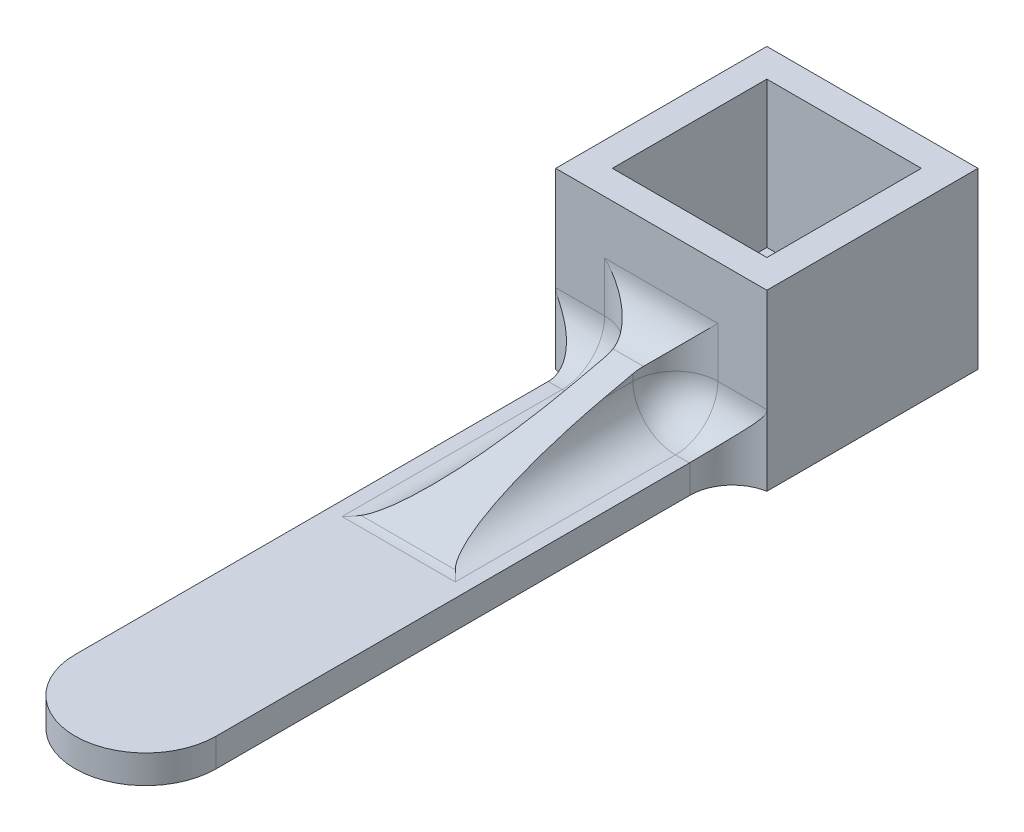
ISO-10303-21;
HEADER;
FILE_DESCRIPTION(('STEP AP214'),'2;1');
FILE_NAME('part.step','',(''),(''),'','','');
FILE_SCHEMA(('AUTOMOTIVE_DESIGN { 1 0 10303 214 1 1 1 1 }'));
ENDSEC;
DATA;
#1=APPLICATION_CONTEXT('core data for automotive mechanical design processes');
#2=APPLICATION_PROTOCOL_DEFINITION('international standard','automotive_design',2000,#1);
#3=PRODUCT_CONTEXT('',#1,'mechanical');
#4=PRODUCT('Part','Part','',(#3));
#5=PRODUCT_RELATED_PRODUCT_CATEGORY('part','',(#4));
#6=PRODUCT_DEFINITION_FORMATION('','',#4);
#7=PRODUCT_DEFINITION_CONTEXT('part definition',#1,'design');
#8=PRODUCT_DEFINITION('design','',#6,#7);
#9=PRODUCT_DEFINITION_SHAPE('','',#8);
#10=(LENGTH_UNIT() NAMED_UNIT(*) SI_UNIT(.MILLI.,.METRE.));
#11=(NAMED_UNIT(*) PLANE_ANGLE_UNIT() SI_UNIT($,.RADIAN.));
#12=(NAMED_UNIT(*) SI_UNIT($,.STERADIAN.) SOLID_ANGLE_UNIT());
#13=UNCERTAINTY_MEASURE_WITH_UNIT(LENGTH_MEASURE(1.E-05),#10,'distance_accuracy_value','');
#14=(GEOMETRIC_REPRESENTATION_CONTEXT(3) GLOBAL_UNCERTAINTY_ASSIGNED_CONTEXT((#13)) GLOBAL_UNIT_ASSIGNED_CONTEXT((#10,
#11,#12)) REPRESENTATION_CONTEXT('',''));
#15=CARTESIAN_POINT('',(0.,0.,0.));
#16=DIRECTION('',(0.,0.,1.));
#17=DIRECTION('',(1.,0.,0.));
#18=AXIS2_PLACEMENT_3D('',#15,#16,#17);
#19=CARTESIAN_POINT('',(0.,10.3,2.));
#20=DIRECTION('',(0.,0.,-1.));
#21=DIRECTION('',(-1.,0.,0.));
#22=AXIS2_PLACEMENT_3D('',#19,#20,#21);
#23=PLANE('',#22);
#24=DIRECTION('',(-1.,0.,0.));
#25=VECTOR('',#24,1.);
#26=CARTESIAN_POINT('',(6.456964415,6.54323824648957,2.));
#27=LINE('',#26,#25);
#28=CARTESIAN_POINT('',(1.456964415,6.54323824648957,2.));
#29=VERTEX_POINT('',#28);
#30=CARTESIAN_POINT('',(9.456964415,6.54323824648957,2.));
#31=VERTEX_POINT('',#30);
#32=EDGE_CURVE('E365',#29,#31,#27,.F.);
#33=ORIENTED_EDGE('',*,*,#32,.T.);
#34=DIRECTION('',(0.,1.,0.));
#35=VECTOR('',#34,1.);
#36=CARTESIAN_POINT('',(9.456964415,3.,2.));
#37=LINE('',#36,#35);
#38=CARTESIAN_POINT('',(9.456964415,3.,2.));
#39=VERTEX_POINT('',#38);
#40=EDGE_CURVE('E604',#31,#39,#37,.F.);
#41=ORIENTED_EDGE('',*,*,#40,.T.);
#42=DIRECTION('',(-1.,0.,0.));
#43=VECTOR('',#42,1.);
#44=CARTESIAN_POINT('',(10.4429391572794,3.,2.));
#45=LINE('',#44,#43);
#46=CARTESIAN_POINT('',(12.91392883,3.,2.));
#47=VERTEX_POINT('',#46);
#48=EDGE_CURVE('E358',#39,#47,#45,.F.);
#49=ORIENTED_EDGE('',*,*,#48,.T.);
#50=DIRECTION('',(0.,-1.,0.));
#51=VECTOR('',#50,1.);
#52=CARTESIAN_POINT('',(12.91392883,10.3,2.));
#53=LINE('',#52,#51);
#54=CARTESIAN_POINT('',(12.91392883,10.3,2.));
#55=VERTEX_POINT('',#54);
#56=EDGE_CURVE('E345',#55,#47,#53,.T.);
#57=ORIENTED_EDGE('',*,*,#56,.F.);
#58=DIRECTION('',(1.,0.,0.));
#59=VECTOR('',#58,1.);
#60=CARTESIAN_POINT('',(0.,10.3,2.));
#61=LINE('',#60,#59);
#62=CARTESIAN_POINT('',(-2.,10.3,2.));
#63=VERTEX_POINT('',#62);
#64=EDGE_CURVE('E329',#63,#55,#61,.T.);
#65=ORIENTED_EDGE('',*,*,#64,.F.);
#66=DIRECTION('',(0.,-1.,0.));
#67=VECTOR('',#66,1.);
#68=CARTESIAN_POINT('',(-2.,10.3,2.));
#69=LINE('',#68,#67);
#70=CARTESIAN_POINT('',(-2.,3.,2.));
#71=VERTEX_POINT('',#70);
#72=EDGE_CURVE('E350',#63,#71,#69,.T.);
#73=ORIENTED_EDGE('',*,*,#72,.T.);
#74=DIRECTION('',(-1.,0.,0.));
#75=VECTOR('',#74,1.);
#76=CARTESIAN_POINT('',(4.456964415,3.,2.));
#77=LINE('',#76,#75);
#78=CARTESIAN_POINT('',(1.456964415,3.,2.));
#79=VERTEX_POINT('',#78);
#80=EDGE_CURVE('E361',#71,#79,#77,.F.);
#81=ORIENTED_EDGE('',*,*,#80,.T.);
#82=DIRECTION('',(0.,1.,0.));
#83=VECTOR('',#82,1.);
#84=CARTESIAN_POINT('',(1.456964415,10.3,2.));
#85=LINE('',#84,#83);
#86=EDGE_CURVE('E577',#79,#29,#85,.T.);
#87=ORIENTED_EDGE('',*,*,#86,.T.);
#88=EDGE_LOOP('',(#33,#41,#49,#57,#65,#73,#81,#87));
#89=FACE_BOUND('',#88,.T.);
#90=ADVANCED_FACE('F65',(#89),#23,.F.);
#91=CARTESIAN_POINT('',(5.456964415,0.,2.));
#92=DIRECTION('',(0.,-1.,0.));
#93=DIRECTION('',(0.,0.,-1.));
#94=AXIS2_PLACEMENT_3D('',#91,#92,#93);
#95=PLANE('',#94);
#96=DIRECTION('',(-1.,0.,0.));
#97=VECTOR('',#96,1.);
#98=CARTESIAN_POINT('',(6.456964415,0.,5.));
#99=LINE('',#98,#97);
#100=CARTESIAN_POINT('',(10.4429391572794,0.,5.));
#101=VERTEX_POINT('',#100);
#102=CARTESIAN_POINT('',(9.456964415,0.,5.));
#103=VERTEX_POINT('',#102);
#104=EDGE_CURVE('E376',#101,#103,#99,.T.);
#105=ORIENTED_EDGE('',*,*,#104,.T.);
#106=DIRECTION('',(0.,0.,-1.));
#107=VECTOR('',#106,1.);
#108=CARTESIAN_POINT('',(9.456964415,0.,20.5478283324558));
#109=LINE('',#108,#107);
#110=CARTESIAN_POINT('',(9.456964415,0.,20.5478283324558));
#111=VERTEX_POINT('',#110);
#112=EDGE_CURVE('E540',#103,#111,#109,.F.);
#113=ORIENTED_EDGE('',*,*,#112,.T.);
#114=DIRECTION('',(-1.,0.,0.));
#115=VECTOR('',#114,1.);
#116=CARTESIAN_POINT('',(4.456964415,0.,20.5478283324558));
#117=LINE('',#116,#115);
#118=CARTESIAN_POINT('',(1.456964415,0.,20.5478283324558));
#119=VERTEX_POINT('',#118);
#120=EDGE_CURVE('E382',#111,#119,#117,.T.);
#121=ORIENTED_EDGE('',*,*,#120,.T.);
#122=DIRECTION('',(0.,0.,-1.));
#123=VECTOR('',#122,1.);
#124=CARTESIAN_POINT('',(1.456964415,0.,2.));
#125=LINE('',#124,#123);
#126=CARTESIAN_POINT('',(1.456964415,0.,5.));
#127=VERTEX_POINT('',#126);
#128=EDGE_CURVE('E550',#119,#127,#125,.T.);
#129=ORIENTED_EDGE('',*,*,#128,.T.);
#130=DIRECTION('',(-1.,0.,0.));
#131=VECTOR('',#130,1.);
#132=CARTESIAN_POINT('',(0.470989672720634,0.,5.));
#133=LINE('',#132,#131);
#134=CARTESIAN_POINT('',(0.470989672720634,0.,5.));
#135=VERTEX_POINT('',#134);
#136=EDGE_CURVE('E379',#127,#135,#133,.T.);
#137=ORIENTED_EDGE('',*,*,#136,.T.);
#138=DIRECTION('',(0.,0.,-1.));
#139=VECTOR('',#138,1.);
#140=CARTESIAN_POINT('',(0.470989672720634,0.,2.));
#141=LINE('',#140,#139);
#142=CARTESIAN_POINT('',(0.470989672720634,0.,38.4206316883251));
#143=VERTEX_POINT('',#142);
#144=EDGE_CURVE('E250',#143,#135,#141,.T.);
#145=ORIENTED_EDGE('',*,*,#144,.F.);
#146=CARTESIAN_POINT('',(5.456964415,0.,38.4206316883251));
#147=DIRECTION('',(0.,-1.,0.));
#148=DIRECTION('',(0.,0.,-1.));
#149=AXIS2_PLACEMENT_3D('',#146,#147,#148);
#150=CIRCLE('',#149,4.98597474227937);
#151=CARTESIAN_POINT('',(10.4429391572794,0.,38.4206316883251));
#152=VERTEX_POINT('',#151);
#153=EDGE_CURVE('E239',#152,#143,#150,.T.);
#154=ORIENTED_EDGE('',*,*,#153,.F.);
#155=DIRECTION('',(0.,0.,1.));
#156=VECTOR('',#155,1.);
#157=CARTESIAN_POINT('',(10.4429391572794,0.,2.));
#158=LINE('',#157,#156);
#159=EDGE_CURVE('E226',#101,#152,#158,.T.);
#160=ORIENTED_EDGE('',*,*,#159,.F.);
#161=EDGE_LOOP('',(#105,#113,#121,#129,#137,#145,#154,#160));
#162=FACE_BOUND('',#161,.T.);
#163=ADVANCED_FACE('F252',(#162),#95,.F.);
#164=CARTESIAN_POINT('',(0.,10.3,0.));
#165=DIRECTION('',(0.,1.,0.));
#166=DIRECTION('',(0.,0.,1.));
#167=AXIS2_PLACEMENT_3D('',#164,#165,#166);
#168=PLANE('',#167);
#169=DIRECTION('',(0.,0.,1.));
#170=VECTOR('',#169,1.);
#171=CARTESIAN_POINT('',(-2.,10.3,0.));
#172=LINE('',#171,#170);
#173=CARTESIAN_POINT('',(-2.,10.3,-12.91392883));
#174=VERTEX_POINT('',#173);
#175=EDGE_CURVE('E325',#174,#63,#172,.T.);
#176=ORIENTED_EDGE('',*,*,#175,.T.);
#177=ORIENTED_EDGE('',*,*,#64,.T.);
#178=DIRECTION('',(0.,0.,-1.));
#179=VECTOR('',#178,1.);
#180=CARTESIAN_POINT('',(12.91392883,10.3,0.));
#181=LINE('',#180,#179);
#182=CARTESIAN_POINT('',(12.91392883,10.3,-12.91392883));
#183=VERTEX_POINT('',#182);
#184=EDGE_CURVE('E332',#55,#183,#181,.T.);
#185=ORIENTED_EDGE('',*,*,#184,.T.);
#186=DIRECTION('',(-1.,0.,0.));
#187=VECTOR('',#186,1.);
#188=CARTESIAN_POINT('',(0.,10.3,-12.91392883));
#189=LINE('',#188,#187);
#190=EDGE_CURVE('E335',#183,#174,#189,.T.);
#191=ORIENTED_EDGE('',*,*,#190,.T.);
#192=EDGE_LOOP('',(#176,#177,#185,#191));
#193=FACE_BOUND('',#192,.T.);
#194=DIRECTION('',(1.,0.,0.));
#195=VECTOR('',#194,1.);
#196=CARTESIAN_POINT('',(0.,10.3,0.));
#197=LINE('',#196,#195);
#198=CARTESIAN_POINT('',(0.,10.3,0.));
#199=VERTEX_POINT('',#198);
#200=CARTESIAN_POINT('',(10.91392883,10.3,0.));
#201=VERTEX_POINT('',#200);
#202=EDGE_CURVE('E287',#199,#201,#197,.T.);
#203=ORIENTED_EDGE('',*,*,#202,.F.);
#204=DIRECTION('',(0.,0.,1.));
#205=VECTOR('',#204,1.);
#206=CARTESIAN_POINT('',(0.,10.3,0.));
#207=LINE('',#206,#205);
#208=CARTESIAN_POINT('',(0.,10.3,-10.91392883));
#209=VERTEX_POINT('',#208);
#210=EDGE_CURVE('E284',#209,#199,#207,.T.);
#211=ORIENTED_EDGE('',*,*,#210,.F.);
#212=DIRECTION('',(-1.,0.,0.));
#213=VECTOR('',#212,1.);
#214=CARTESIAN_POINT('',(0.,10.3,-10.91392883));
#215=LINE('',#214,#213);
#216=CARTESIAN_POINT('',(10.91392883,10.3,-10.91392883));
#217=VERTEX_POINT('',#216);
#218=EDGE_CURVE('E295',#217,#209,#215,.T.);
#219=ORIENTED_EDGE('',*,*,#218,.F.);
#220=DIRECTION('',(0.,0.,-1.));
#221=VECTOR('',#220,1.);
#222=CARTESIAN_POINT('',(10.91392883,10.3,0.));
#223=LINE('',#222,#221);
#224=EDGE_CURVE('E291',#201,#217,#223,.T.);
#225=ORIENTED_EDGE('',*,*,#224,.F.);
#226=EDGE_LOOP('',(#203,#211,#219,#225));
#227=FACE_BOUND('',#226,.T.);
#228=ADVANCED_FACE('F501',(#193,#227),#168,.T.);
#229=CARTESIAN_POINT('',(-2.,10.3,0.));
#230=DIRECTION('',(1.,0.,0.));
#231=DIRECTION('',(0.,0.,-1.));
#232=AXIS2_PLACEMENT_3D('',#229,#230,#231);
#233=PLANE('',#232);
#234=DIRECTION('',(0.,-1.,0.));
#235=VECTOR('',#234,1.);
#236=CARTESIAN_POINT('',(-2.,10.3,-12.91392883));
#237=LINE('',#236,#235);
#238=CARTESIAN_POINT('',(-2.,-2.,-12.91392883));
#239=VERTEX_POINT('',#238);
#240=EDGE_CURVE('E338',#174,#239,#237,.T.);
#241=ORIENTED_EDGE('',*,*,#240,.T.);
#242=DIRECTION('',(0.,0.,-1.));
#243=VECTOR('',#242,1.);
#244=CARTESIAN_POINT('',(-2.,-2.,2.));
#245=LINE('',#244,#243);
#246=CARTESIAN_POINT('',(-2.,-2.,2.));
#247=VERTEX_POINT('',#246);
#248=EDGE_CURVE('E270',#247,#239,#245,.T.);
#249=ORIENTED_EDGE('',*,*,#248,.F.);
#250=EDGE_CURVE('E349',#71,#247,#69,.T.);
#251=ORIENTED_EDGE('',*,*,#250,.F.);
#252=ORIENTED_EDGE('',*,*,#72,.F.);
#253=ORIENTED_EDGE('',*,*,#175,.F.);
#254=EDGE_LOOP('',(#241,#249,#251,#252,#253));
#255=FACE_BOUND('',#254,.T.);
#256=ADVANCED_FACE('F505',(#255),#233,.F.);
#257=CARTESIAN_POINT('',(12.91392883,10.3,0.));
#258=DIRECTION('',(-1.,0.,0.));
#259=DIRECTION('',(0.,0.,1.));
#260=AXIS2_PLACEMENT_3D('',#257,#258,#259);
#261=PLANE('',#260);
#262=ORIENTED_EDGE('',*,*,#56,.T.);
#263=CARTESIAN_POINT('',(12.91392883,-2.,2.));
#264=VERTEX_POINT('',#263);
#265=EDGE_CURVE('E344',#47,#264,#53,.T.);
#266=ORIENTED_EDGE('',*,*,#265,.T.);
#267=DIRECTION('',(0.,0.,1.));
#268=VECTOR('',#267,1.);
#269=CARTESIAN_POINT('',(12.91392883,-2.,-12.91392883));
#270=LINE('',#269,#268);
#271=CARTESIAN_POINT('',(12.91392883,-2.,-12.91392883));
#272=VERTEX_POINT('',#271);
#273=EDGE_CURVE('E279',#272,#264,#270,.T.);
#274=ORIENTED_EDGE('',*,*,#273,.F.);
#275=DIRECTION('',(0.,-1.,0.));
#276=VECTOR('',#275,1.);
#277=CARTESIAN_POINT('',(12.91392883,10.3,-12.91392883));
#278=LINE('',#277,#276);
#279=EDGE_CURVE('E341',#183,#272,#278,.T.);
#280=ORIENTED_EDGE('',*,*,#279,.F.);
#281=ORIENTED_EDGE('',*,*,#184,.F.);
#282=EDGE_LOOP('',(#262,#266,#274,#280,#281));
#283=FACE_BOUND('',#282,.T.);
#284=ADVANCED_FACE('F503',(#283),#261,.F.);
#285=CARTESIAN_POINT('',(0.,10.3,-12.91392883));
#286=DIRECTION('',(0.,0.,1.));
#287=DIRECTION('',(1.,0.,0.));
#288=AXIS2_PLACEMENT_3D('',#285,#286,#287);
#289=PLANE('',#288);
#290=ORIENTED_EDGE('',*,*,#279,.T.);
#291=DIRECTION('',(1.,0.,0.));
#292=VECTOR('',#291,1.);
#293=CARTESIAN_POINT('',(-2.,-2.,-12.91392883));
#294=LINE('',#293,#292);
#295=EDGE_CURVE('E275',#239,#272,#294,.T.);
#296=ORIENTED_EDGE('',*,*,#295,.F.);
#297=ORIENTED_EDGE('',*,*,#240,.F.);
#298=ORIENTED_EDGE('',*,*,#190,.F.);
#299=EDGE_LOOP('',(#290,#296,#297,#298));
#300=FACE_BOUND('',#299,.T.);
#301=ADVANCED_FACE('F512',(#300),#289,.F.);
#302=CARTESIAN_POINT('',(0.,10.3,0.));
#303=DIRECTION('',(1.,0.,0.));
#304=DIRECTION('',(0.,0.,-1.));
#305=AXIS2_PLACEMENT_3D('',#302,#303,#304);
#306=PLANE('',#305);
#307=DIRECTION('',(0.,0.,1.));
#308=VECTOR('',#307,1.);
#309=CARTESIAN_POINT('',(0.,0.,0.));
#310=LINE('',#309,#308);
#311=CARTESIAN_POINT('',(0.,0.,-10.91392883));
#312=VERTEX_POINT('',#311);
#313=CARTESIAN_POINT('',(0.,0.,0.));
#314=VERTEX_POINT('',#313);
#315=EDGE_CURVE('E283',#312,#314,#310,.T.);
#316=ORIENTED_EDGE('',*,*,#315,.F.);
#317=DIRECTION('',(0.,-1.,0.));
#318=VECTOR('',#317,1.);
#319=CARTESIAN_POINT('',(0.,10.3,-10.91392883));
#320=LINE('',#319,#318);
#321=EDGE_CURVE('E298',#209,#312,#320,.T.);
#322=ORIENTED_EDGE('',*,*,#321,.F.);
#323=ORIENTED_EDGE('',*,*,#210,.T.);
#324=DIRECTION('',(0.,-1.,0.));
#325=VECTOR('',#324,1.);
#326=CARTESIAN_POINT('',(0.,10.3,0.));
#327=LINE('',#326,#325);
#328=EDGE_CURVE('E321',#199,#314,#327,.T.);
#329=ORIENTED_EDGE('',*,*,#328,.T.);
#330=EDGE_LOOP('',(#316,#322,#323,#329));
#331=FACE_BOUND('',#330,.T.);
#332=ADVANCED_FACE('F662',(#331),#306,.T.);
#333=CARTESIAN_POINT('',(0.,10.3,0.));
#334=DIRECTION('',(0.,0.,-1.));
#335=DIRECTION('',(-1.,0.,0.));
#336=AXIS2_PLACEMENT_3D('',#333,#334,#335);
#337=PLANE('',#336);
#338=DIRECTION('',(1.,0.,0.));
#339=VECTOR('',#338,1.);
#340=CARTESIAN_POINT('',(0.,0.,0.));
#341=LINE('',#340,#339);
#342=CARTESIAN_POINT('',(10.91392883,0.,0.));
#343=VERTEX_POINT('',#342);
#344=EDGE_CURVE('E302',#314,#343,#341,.T.);
#345=ORIENTED_EDGE('',*,*,#344,.F.);
#346=ORIENTED_EDGE('',*,*,#328,.F.);
#347=ORIENTED_EDGE('',*,*,#202,.T.);
#348=DIRECTION('',(0.,-1.,0.));
#349=VECTOR('',#348,1.);
#350=CARTESIAN_POINT('',(10.91392883,10.3,0.));
#351=LINE('',#350,#349);
#352=EDGE_CURVE('E317',#201,#343,#351,.T.);
#353=ORIENTED_EDGE('',*,*,#352,.T.);
#354=EDGE_LOOP('',(#345,#346,#347,#353));
#355=FACE_BOUND('',#354,.T.);
#356=ADVANCED_FACE('F653',(#355),#337,.T.);
#357=CARTESIAN_POINT('',(10.91392883,10.3,0.));
#358=DIRECTION('',(-1.,0.,0.));
#359=DIRECTION('',(0.,0.,1.));
#360=AXIS2_PLACEMENT_3D('',#357,#358,#359);
#361=PLANE('',#360);
#362=DIRECTION('',(0.,0.,-1.));
#363=VECTOR('',#362,1.);
#364=CARTESIAN_POINT('',(10.91392883,0.,0.));
#365=LINE('',#364,#363);
#366=CARTESIAN_POINT('',(10.91392883,0.,-10.91392883));
#367=VERTEX_POINT('',#366);
#368=EDGE_CURVE('E305',#343,#367,#365,.T.);
#369=ORIENTED_EDGE('',*,*,#368,.F.);
#370=ORIENTED_EDGE('',*,*,#352,.F.);
#371=ORIENTED_EDGE('',*,*,#224,.T.);
#372=DIRECTION('',(0.,-1.,0.));
#373=VECTOR('',#372,1.);
#374=CARTESIAN_POINT('',(10.91392883,10.3,-10.91392883));
#375=LINE('',#374,#373);
#376=EDGE_CURVE('E314',#217,#367,#375,.T.);
#377=ORIENTED_EDGE('',*,*,#376,.T.);
#378=EDGE_LOOP('',(#369,#370,#371,#377));
#379=FACE_BOUND('',#378,.T.);
#380=ADVANCED_FACE('F656',(#379),#361,.T.);
#381=CARTESIAN_POINT('',(0.,10.3,-10.91392883));
#382=DIRECTION('',(0.,0.,1.));
#383=DIRECTION('',(1.,0.,0.));
#384=AXIS2_PLACEMENT_3D('',#381,#382,#383);
#385=PLANE('',#384);
#386=DIRECTION('',(-1.,0.,0.));
#387=VECTOR('',#386,1.);
#388=CARTESIAN_POINT('',(0.,0.,-10.91392883));
#389=LINE('',#388,#387);
#390=EDGE_CURVE('E288',#367,#312,#389,.T.);
#391=ORIENTED_EDGE('',*,*,#390,.F.);
#392=ORIENTED_EDGE('',*,*,#376,.F.);
#393=ORIENTED_EDGE('',*,*,#218,.T.);
#394=ORIENTED_EDGE('',*,*,#321,.T.);
#395=EDGE_LOOP('',(#391,#392,#393,#394));
#396=FACE_BOUND('',#395,.T.);
#397=ADVANCED_FACE('F665',(#396),#385,.T.);
#398=CARTESIAN_POINT('',(0.,0.,0.));
#399=DIRECTION('',(0.,-1.,0.));
#400=DIRECTION('',(0.,0.,-1.));
#401=AXIS2_PLACEMENT_3D('',#398,#399,#400);
#402=PLANE('',#401);
#403=ORIENTED_EDGE('',*,*,#344,.T.);
#404=ORIENTED_EDGE('',*,*,#368,.T.);
#405=ORIENTED_EDGE('',*,*,#390,.T.);
#406=ORIENTED_EDGE('',*,*,#315,.T.);
#407=EDGE_LOOP('',(#403,#404,#405,#406));
#408=FACE_BOUND('',#407,.T.);
#409=ADVANCED_FACE('F659',(#408),#402,.F.);
#410=CARTESIAN_POINT('',(0.,-2.,0.));
#411=DIRECTION('',(0.,-1.,0.));
#412=DIRECTION('',(0.,0.,-1.));
#413=AXIS2_PLACEMENT_3D('',#410,#411,#412);
#414=PLANE('',#413);
#415=ORIENTED_EDGE('',*,*,#273,.T.);
#416=CARTESIAN_POINT('',(13.4429391572794,-2.,4.95298968396975));
#417=DIRECTION('',(0.,-1.,0.));
#418=DIRECTION('',(0.,0.,-1.));
#419=AXIS2_PLACEMENT_3D('',#416,#417,#418);
#420=CIRCLE('',#419,3.);
#421=CARTESIAN_POINT('',(10.4429391572794,-2.,4.95298968396975));
#422=VERTEX_POINT('',#421);
#423=EDGE_CURVE('E393',#264,#422,#420,.F.);
#424=ORIENTED_EDGE('',*,*,#423,.T.);
#425=DIRECTION('',(0.,0.,1.));
#426=VECTOR('',#425,1.);
#427=CARTESIAN_POINT('',(10.4429391572794,-2.,2.));
#428=LINE('',#427,#426);
#429=CARTESIAN_POINT('',(10.4429391572794,-2.,38.4206316883251));
#430=VERTEX_POINT('',#429);
#431=EDGE_CURVE('E260',#422,#430,#428,.T.);
#432=ORIENTED_EDGE('',*,*,#431,.T.);
#433=CARTESIAN_POINT('',(5.456964415,-2.,38.4206316883251));
#434=DIRECTION('',(0.,-1.,0.));
#435=DIRECTION('',(0.,0.,-1.));
#436=AXIS2_PLACEMENT_3D('',#433,#434,#435);
#437=CIRCLE('',#436,4.98597474227937);
#438=CARTESIAN_POINT('',(0.470989672720634,-2.,38.4206316883251));
#439=VERTEX_POINT('',#438);
#440=EDGE_CURVE('E247',#430,#439,#437,.T.);
#441=ORIENTED_EDGE('',*,*,#440,.T.);
#442=DIRECTION('',(0.,0.,-1.));
#443=VECTOR('',#442,1.);
#444=CARTESIAN_POINT('',(0.470989672720634,-2.,2.));
#445=LINE('',#444,#443);
#446=CARTESIAN_POINT('',(0.470989672720634,-2.,4.95298968396975));
#447=VERTEX_POINT('',#446);
#448=EDGE_CURVE('E240',#439,#447,#445,.T.);
#449=ORIENTED_EDGE('',*,*,#448,.T.);
#450=CARTESIAN_POINT('',(-2.52901032727937,-2.,4.95298968396975));
#451=DIRECTION('',(0.,-1.,0.));
#452=DIRECTION('',(0.,0.,-1.));
#453=AXIS2_PLACEMENT_3D('',#450,#451,#452);
#454=CIRCLE('',#453,3.);
#455=EDGE_CURVE('E385',#447,#247,#454,.F.);
#456=ORIENTED_EDGE('',*,*,#455,.T.);
#457=ORIENTED_EDGE('',*,*,#248,.T.);
#458=ORIENTED_EDGE('',*,*,#295,.T.);
#459=EDGE_LOOP('',(#415,#424,#432,#441,#449,#456,#457,#458));
#460=FACE_BOUND('',#459,.T.);
#461=ADVANCED_FACE('F405',(#460),#414,.T.);
#462=CARTESIAN_POINT('',(0.470989672720634,0.,2.));
#463=DIRECTION('',(-1.,0.,0.));
#464=DIRECTION('',(0.,0.,1.));
#465=AXIS2_PLACEMENT_3D('',#462,#463,#464);
#466=PLANE('',#465);
#467=ORIENTED_EDGE('',*,*,#144,.T.);
#468=CARTESIAN_POINT('',(0.470989672720634,3.,5.));
#469=DIRECTION('',(-1.,0.,0.));
#470=DIRECTION('',(0.,0.,1.));
#471=AXIS2_PLACEMENT_3D('',#468,#469,#470);
#472=CIRCLE('',#471,3.);
#473=CARTESIAN_POINT('',(0.470989672720634,0.000368350915943357,4.95298968396975));
#474=VERTEX_POINT('',#473);
#475=EDGE_CURVE('E419',#135,#474,#472,.F.);
#476=ORIENTED_EDGE('',*,*,#475,.T.);
#477=CARTESIAN_POINT('',(0.470989672720634,0.000368350915943357,4.95298968396975));
#478=CARTESIAN_POINT('',(0.470989672720634,0.,4.95298968396975));
#479=B_SPLINE_CURVE_WITH_KNOTS('',1,(#477,#478),.UNSPECIFIED.,.F.,.F.,(2,2),(0.,1.),.UNSPECIFIED.);
#480=CARTESIAN_POINT('',(0.470989672720634,0.,4.95298968396975));
#481=VERTEX_POINT('',#480);
#482=EDGE_CURVE('E388',#474,#481,#479,.T.);
#483=ORIENTED_EDGE('',*,*,#482,.T.);
#484=DIRECTION('',(0.,1.,0.));
#485=VECTOR('',#484,1.);
#486=CARTESIAN_POINT('',(0.470989672720634,-2.,4.95298968396975));
#487=LINE('',#486,#485);
#488=EDGE_CURVE('E354',#481,#447,#487,.F.);
#489=ORIENTED_EDGE('',*,*,#488,.T.);
#490=ORIENTED_EDGE('',*,*,#448,.F.);
#491=DIRECTION('',(0.,-1.,0.));
#492=VECTOR('',#491,1.);
#493=CARTESIAN_POINT('',(0.470989672720634,0.,38.4206316883251));
#494=LINE('',#493,#492);
#495=EDGE_CURVE('E249',#143,#439,#494,.T.);
#496=ORIENTED_EDGE('',*,*,#495,.F.);
#497=EDGE_LOOP('',(#467,#476,#483,#489,#490,#496));
#498=FACE_BOUND('',#497,.T.);
#499=ADVANCED_FACE('F395',(#498),#466,.T.);
#500=CARTESIAN_POINT('',(5.456964415,0.,38.4206316883251));
#501=DIRECTION('',(0.,-1.,0.));
#502=DIRECTION('',(0.,0.,-1.));
#503=AXIS2_PLACEMENT_3D('',#500,#501,#502);
#504=CYLINDRICAL_SURFACE('',#503,4.98597474227937);
#505=ORIENTED_EDGE('',*,*,#440,.F.);
#506=DIRECTION('',(0.,-1.,0.));
#507=VECTOR('',#506,1.);
#508=CARTESIAN_POINT('',(10.4429391572794,0.,38.4206316883251));
#509=LINE('',#508,#507);
#510=EDGE_CURVE('E230',#152,#430,#509,.T.);
#511=ORIENTED_EDGE('',*,*,#510,.F.);
#512=ORIENTED_EDGE('',*,*,#153,.T.);
#513=ORIENTED_EDGE('',*,*,#495,.T.);
#514=EDGE_LOOP('',(#505,#511,#512,#513));
#515=FACE_BOUND('',#514,.T.);
#516=ADVANCED_FACE('F244',(#515),#504,.T.);
#517=CARTESIAN_POINT('',(10.4429391572794,0.,2.));
#518=DIRECTION('',(1.,0.,0.));
#519=DIRECTION('',(0.,0.,-1.));
#520=AXIS2_PLACEMENT_3D('',#517,#518,#519);
#521=PLANE('',#520);
#522=ORIENTED_EDGE('',*,*,#431,.F.);
#523=DIRECTION('',(0.,-1.,0.));
#524=VECTOR('',#523,1.);
#525=CARTESIAN_POINT('',(10.4429391572794,0.,4.95298968396975));
#526=LINE('',#525,#524);
#527=CARTESIAN_POINT('',(10.4429391572794,0.,4.95298968396975));
#528=VERTEX_POINT('',#527);
#529=EDGE_CURVE('E368',#422,#528,#526,.F.);
#530=ORIENTED_EDGE('',*,*,#529,.T.);
#531=CARTESIAN_POINT('',(10.4429391572794,0.,4.95298968396975));
#532=CARTESIAN_POINT('',(10.4429391572794,0.000368350915943357,4.95298968396975));
#533=B_SPLINE_CURVE_WITH_KNOTS('',1,(#531,#532),.UNSPECIFIED.,.F.,.F.,(2,2),(0.,1.),.UNSPECIFIED.);
#534=CARTESIAN_POINT('',(10.4429391572794,0.000368350915943357,4.95298968396975));
#535=VERTEX_POINT('',#534);
#536=EDGE_CURVE('E415',#528,#535,#533,.T.);
#537=ORIENTED_EDGE('',*,*,#536,.T.);
#538=CARTESIAN_POINT('',(10.4429391572794,3.,5.));
#539=DIRECTION('',(1.,0.,0.));
#540=DIRECTION('',(0.,0.,-1.));
#541=AXIS2_PLACEMENT_3D('',#538,#539,#540);
#542=CIRCLE('',#541,3.);
#543=EDGE_CURVE('E233',#535,#101,#542,.F.);
#544=ORIENTED_EDGE('',*,*,#543,.T.);
#545=ORIENTED_EDGE('',*,*,#159,.T.);
#546=ORIENTED_EDGE('',*,*,#510,.T.);
#547=EDGE_LOOP('',(#522,#530,#537,#544,#545,#546));
#548=FACE_BOUND('',#547,.T.);
#549=ADVANCED_FACE('F229',(#548),#521,.T.);
#550=CARTESIAN_POINT('',(6.456964415,4.15,2.));
#551=DIRECTION('',(0.,-0.975002030684577,-0.222195949920224));
#552=DIRECTION('',(0.,0.222195949920224,-0.975002030684577));
#553=AXIS2_PLACEMENT_3D('',#550,#551,#552);
#554=PLANE('',#553);
#555=DIRECTION('',(0.,-0.222195949920224,0.975002030684577));
#556=VECTOR('',#555,1.);
#557=CARTESIAN_POINT('',(6.456964415,4.15,2.));
#558=LINE('',#557,#556);
#559=CARTESIAN_POINT('',(6.456964415,3.46632157802519,5.));
#560=VERTEX_POINT('',#559);
#561=CARTESIAN_POINT('',(6.456964415,3.,7.04623210139444));
#562=VERTEX_POINT('',#561);
#563=EDGE_CURVE('E263',#560,#562,#558,.T.);
#564=ORIENTED_EDGE('',*,*,#563,.F.);
#565=CARTESIAN_POINT('',(9.456964415,3.46632157802519,5.));
#566=DIRECTION('',(0.,-0.975002030684577,-0.222195949920224));
#567=DIRECTION('',(0.,-0.222195949920224,0.975002030684577));
#568=AXIS2_PLACEMENT_3D('',#565,#566,#567);
#569=ELLIPSE('',#568,3.07691666846439,3.);
#570=CARTESIAN_POINT('',(6.53195832294627,3.61823215443584,4.33341215023933));
#571=VERTEX_POINT('',#570);
#572=EDGE_CURVE('E619',#560,#571,#569,.T.);
#573=ORIENTED_EDGE('',*,*,#572,.T.);
#574=DIRECTION('',(-1.,0.,0.));
#575=VECTOR('',#574,1.);
#576=CARTESIAN_POINT('',(4.456964415,3.61823215443584,4.33341215023933));
#577=LINE('',#576,#575);
#578=CARTESIAN_POINT('',(4.38197050705373,3.61823215443584,4.33341215023933));
#579=VERTEX_POINT('',#578);
#580=EDGE_CURVE('E82',#571,#579,#577,.T.);
#581=ORIENTED_EDGE('',*,*,#580,.T.);
#582=CARTESIAN_POINT('',(1.456964415,3.46632157802519,5.));
#583=DIRECTION('',(0.,-0.975002030684577,-0.222195949920224));
#584=DIRECTION('',(0.,0.222195949920224,-0.975002030684577));
#585=AXIS2_PLACEMENT_3D('',#582,#583,#584);
#586=ELLIPSE('',#585,3.07691666846439,3.);
#587=CARTESIAN_POINT('',(4.456964415,3.46632157802519,5.));
#588=VERTEX_POINT('',#587);
#589=EDGE_CURVE('E12',#579,#588,#586,.T.);
#590=ORIENTED_EDGE('',*,*,#589,.T.);
#591=DIRECTION('',(0.,-0.222195949920224,0.975002030684577));
#592=VECTOR('',#591,1.);
#593=CARTESIAN_POINT('',(4.456964415,4.15,2.));
#594=LINE('',#593,#592);
#595=CARTESIAN_POINT('',(4.456964415,3.,7.04623210139444));
#596=VERTEX_POINT('',#595);
#597=EDGE_CURVE('E440',#588,#596,#594,.T.);
#598=ORIENTED_EDGE('',*,*,#597,.T.);
#599=CARTESIAN_POINT('',(1.456964415,3.,7.04623210139444));
#600=DIRECTION('',(0.,-0.975002030684577,-0.222195949920224));
#601=DIRECTION('',(0.,0.222195949920224,-0.975002030684577));
#602=AXIS2_PLACEMENT_3D('',#599,#600,#601);
#603=ELLIPSE('',#602,13.5015962310614,3.);
#604=CARTESIAN_POINT('',(2.12355226476067,0.074993907946267,19.8812404826952));
#605=VERTEX_POINT('',#604);
#606=EDGE_CURVE('E612',#596,#605,#603,.T.);
#607=ORIENTED_EDGE('',*,*,#606,.T.);
#608=DIRECTION('',(-1.,0.,0.));
#609=VECTOR('',#608,1.);
#610=CARTESIAN_POINT('',(6.456964415,0.074993907946267,19.8812404826952));
#611=LINE('',#610,#609);
#612=CARTESIAN_POINT('',(8.79037656523933,0.074993907946267,19.8812404826952));
#613=VERTEX_POINT('',#612);
#614=EDGE_CURVE('E371',#605,#613,#611,.F.);
#615=ORIENTED_EDGE('',*,*,#614,.T.);
#616=CARTESIAN_POINT('',(9.456964415,3.,7.04623210139444));
#617=DIRECTION('',(0.,-0.975002030684577,-0.222195949920224));
#618=DIRECTION('',(0.,-0.222195949920224,0.975002030684577));
#619=AXIS2_PLACEMENT_3D('',#616,#617,#618);
#620=ELLIPSE('',#619,13.5015962310614,3.);
#621=EDGE_CURVE('E609',#613,#562,#620,.T.);
#622=ORIENTED_EDGE('',*,*,#621,.T.);
#623=EDGE_LOOP('',(#564,#573,#581,#590,#598,#607,#615,#622));
#624=FACE_BOUND('',#623,.T.);
#625=ADVANCED_FACE('F413',(#624),#554,.F.);
#626=CARTESIAN_POINT('',(6.456964415,0.,0.));
#627=DIRECTION('',(-1.,0.,0.));
#628=DIRECTION('',(0.,0.,1.));
#629=AXIS2_PLACEMENT_3D('',#626,#627,#628);
#630=PLANE('',#629);
#631=ORIENTED_EDGE('',*,*,#563,.T.);
#632=DIRECTION('',(0.,0.,-1.));
#633=VECTOR('',#632,1.);
#634=CARTESIAN_POINT('',(6.456964415,3.,5.));
#635=LINE('',#634,#633);
#636=CARTESIAN_POINT('',(6.456964415,3.,5.));
#637=VERTEX_POINT('',#636);
#638=EDGE_CURVE('E581',#562,#637,#635,.T.);
#639=ORIENTED_EDGE('',*,*,#638,.T.);
#640=DIRECTION('',(0.,1.,0.));
#641=VECTOR('',#640,1.);
#642=CARTESIAN_POINT('',(6.456964415,6.54323824648957,5.));
#643=LINE('',#642,#641);
#644=EDGE_CURVE('E429',#637,#560,#643,.T.);
#645=ORIENTED_EDGE('',*,*,#644,.T.);
#646=EDGE_LOOP('',(#631,#639,#645));
#647=FACE_BOUND('',#646,.T.);
#648=ADVANCED_FACE('F640',(#647),#630,.F.);
#649=CARTESIAN_POINT('',(4.456964415,0.,0.));
#650=DIRECTION('',(-1.,0.,0.));
#651=DIRECTION('',(0.,0.,1.));
#652=AXIS2_PLACEMENT_3D('',#649,#650,#651);
#653=PLANE('',#652);
#654=DIRECTION('',(0.,1.,0.));
#655=VECTOR('',#654,1.);
#656=CARTESIAN_POINT('',(4.456964415,0.,5.));
#657=LINE('',#656,#655);
#658=CARTESIAN_POINT('',(4.456964415,3.,5.));
#659=VERTEX_POINT('',#658);
#660=EDGE_CURVE('E596',#588,#659,#657,.F.);
#661=ORIENTED_EDGE('',*,*,#660,.T.);
#662=DIRECTION('',(0.,0.,-1.));
#663=VECTOR('',#662,1.);
#664=CARTESIAN_POINT('',(4.456964415,3.,0.));
#665=LINE('',#664,#663);
#666=EDGE_CURVE('E570',#659,#596,#665,.F.);
#667=ORIENTED_EDGE('',*,*,#666,.T.);
#668=ORIENTED_EDGE('',*,*,#597,.F.);
#669=EDGE_LOOP('',(#661,#667,#668));
#670=FACE_BOUND('',#669,.T.);
#671=ADVANCED_FACE('F634',(#670),#653,.T.);
#672=CARTESIAN_POINT('',(5.456964415,3.,5.));
#673=DIRECTION('',(1.,0.,0.));
#674=DIRECTION('',(0.,0.,-1.));
#675=AXIS2_PLACEMENT_3D('',#672,#673,#674);
#676=CYLINDRICAL_SURFACE('',#675,3.);
#677=ORIENTED_EDGE('',*,*,#136,.F.);
#678=CARTESIAN_POINT('',(1.456964415,3.,5.));
#679=DIRECTION('',(1.,0.,0.));
#680=DIRECTION('',(0.,0.,-1.));
#681=AXIS2_PLACEMENT_3D('',#678,#679,#680);
#682=CIRCLE('',#681,3.);
#683=EDGE_CURVE('E571',#127,#79,#682,.T.);
#684=ORIENTED_EDGE('',*,*,#683,.T.);
#685=ORIENTED_EDGE('',*,*,#80,.F.);
#686=CARTESIAN_POINT('',(-2.,3.,2.));
#687=CARTESIAN_POINT('',(-2.00020741561921,2.95866122550813,1.99998139066049));
#688=CARTESIAN_POINT('',(-1.99520250943113,2.91784993809646,2.00085296313656));
#689=CARTESIAN_POINT('',(-1.97763147927653,2.83893571768813,2.00407828048105));
#690=CARTESIAN_POINT('',(-1.96525656710579,2.80079066442478,2.00639461122273));
#691=CARTESIAN_POINT('',(-1.93422329625118,2.72341835513874,2.01249863807748));
#692=CARTESIAN_POINT('',(-1.91510059717036,2.68440134826423,2.016399752291));
#693=CARTESIAN_POINT('',(-1.87338978178264,2.60837564116702,2.02542640179537));
#694=CARTESIAN_POINT('',(-1.85079498283423,2.57137100409765,2.03055430908594));
#695=CARTESIAN_POINT('',(-1.77900054061341,2.46113526192303,2.04783713877849));
#696=CARTESIAN_POINT('',(-1.72659967758403,2.39031133678707,2.0617485843967));
#697=CARTESIAN_POINT('',(-1.5899977039373,2.21523097754181,2.10242143566457));
#698=CARTESIAN_POINT('',(-1.50375733384591,2.11331684339419,2.13207781667323));
#699=CARTESIAN_POINT('',(-1.32983924341,1.91402604400385,2.20147499439165));
#700=CARTESIAN_POINT('',(-1.2421596338587,1.8166561169378,2.24123023645273));
#701=CARTESIAN_POINT('',(-1.06846476810389,1.62671920566237,2.33072490153292));
#702=CARTESIAN_POINT('',(-0.982441729680788,1.53411893563516,2.38037828492533));
#703=CARTESIAN_POINT('',(-0.812894726043423,1.35309901392708,2.49023696393462));
#704=CARTESIAN_POINT('',(-0.72936874211133,1.26467594971922,2.55043345034006));
#705=CARTESIAN_POINT('',(-0.589261977099237,1.11704963173934,2.66322786051664));
#706=CARTESIAN_POINT('',(-0.531756763828395,1.0566707173837,2.71314008029257));
#707=CARTESIAN_POINT('',(-0.419232760652099,0.938786447110996,2.81879135702248));
#708=CARTESIAN_POINT('',(-0.364214138147374,0.881281284631413,2.87453080543911));
#709=CARTESIAN_POINT('',(-0.203759070262055,0.713787810159345,3.05077744575694));
#710=CARTESIAN_POINT('',(-0.102797901147302,0.608689864880013,3.18041122266567));
#711=CARTESIAN_POINT('',(0.059266457336793,0.439873399268658,3.43065118934112));
#712=CARTESIAN_POINT('',(0.124153739140318,0.372242086246171,3.54617277965927));
#713=CARTESIAN_POINT('',(0.240059698100515,0.251075044493176,3.79088120438989));
#714=CARTESIAN_POINT('',(0.291093283396564,0.197524165593633,3.92005313978566));
#715=CARTESIAN_POINT('',(0.369139784334166,0.114955187891324,4.16877249118154));
#716=CARTESIAN_POINT('',(0.398652815205567,0.0834181731982381,4.28669720561737));
#717=CARTESIAN_POINT('',(0.443256526725,0.0348189906103659,4.52803222049895));
#718=CARTESIAN_POINT('',(0.45838095772671,0.0177229601097626,4.65142896977589));
#719=CARTESIAN_POINT('',(0.467493015134475,0.0061854021658692,4.80516738028622));
#720=CARTESIAN_POINT('',(0.468803706009888,0.0044101048639983,4.83470460970254));
#721=CARTESIAN_POINT('',(0.470550845203932,0.00173467341392074,4.89381870475481));
#722=CARTESIAN_POINT('',(0.470988054158902,0.000833778179984727,4.92339551344218));
#723=CARTESIAN_POINT('',(0.470989672720634,0.000368350915943395,4.95298968396975));
#724=B_SPLINE_CURVE_WITH_KNOTS('',3,(#686,#687,#688,#689,#690,#691,#692,#693,#694,#695,#696,
#697,#698,#699,#700,#701,#702,#703,#704,#705,#706,#707,#708,#709,#710,#711,#712,#713,#714,#715,
#716,#717,#718,#719,#720,#721,#722,#723),.UNSPECIFIED.,.F.,.F.,(4,2,2,2,2,2,2,2,2,2,2,2,2,2,2,2,
2,2,4),(0.,0.122894778299693,0.242732082606438,0.373327197219787,0.504176887267441,
0.771297859663704,1.18105758686538,1.59140676518661,1.9983333863305,2.40492161100727,
2.69621496314833,2.98752789643874,3.56953923336201,4.01425139613425,4.45848308412703,
4.83369633361997,5.20802728515517,5.29687070982505,5.38563673501803),.UNSPECIFIED.);
#725=EDGE_CURVE('E430',#474,#71,#724,.F.);
#726=ORIENTED_EDGE('',*,*,#725,.F.);
#727=ORIENTED_EDGE('',*,*,#475,.F.);
#728=EDGE_LOOP('',(#677,#684,#685,#726,#727));
#729=FACE_BOUND('',#728,.T.);
#730=ADVANCED_FACE('F449',(#729),#676,.F.);
#731=CARTESIAN_POINT('',(-2.52901032727937,10.3,4.95298968396975));
#732=DIRECTION('',(0.,-1.,0.));
#733=DIRECTION('',(0.,0.,-1.));
#734=AXIS2_PLACEMENT_3D('',#731,#732,#733);
#735=CYLINDRICAL_SURFACE('',#734,3.);
#736=ORIENTED_EDGE('',*,*,#725,.T.);
#737=ORIENTED_EDGE('',*,*,#250,.T.);
#738=ORIENTED_EDGE('',*,*,#455,.F.);
#739=ORIENTED_EDGE('',*,*,#488,.F.);
#740=ORIENTED_EDGE('',*,*,#482,.F.);
#741=EDGE_LOOP('',(#736,#737,#738,#739,#740));
#742=FACE_BOUND('',#741,.T.);
#743=ADVANCED_FACE('F452',(#742),#735,.F.);
#744=CARTESIAN_POINT('',(5.456964415,3.,5.));
#745=DIRECTION('',(1.,0.,0.));
#746=DIRECTION('',(0.,0.,-1.));
#747=AXIS2_PLACEMENT_3D('',#744,#745,#746);
#748=CYLINDRICAL_SURFACE('',#747,3.);
#749=ORIENTED_EDGE('',*,*,#48,.F.);
#750=CARTESIAN_POINT('',(9.456964415,3.,5.));
#751=DIRECTION('',(1.,0.,0.));
#752=DIRECTION('',(0.,0.,-1.));
#753=AXIS2_PLACEMENT_3D('',#750,#751,#752);
#754=CIRCLE('',#753,3.);
#755=EDGE_CURVE('E537',#39,#103,#754,.F.);
#756=ORIENTED_EDGE('',*,*,#755,.T.);
#757=ORIENTED_EDGE('',*,*,#104,.F.);
#758=ORIENTED_EDGE('',*,*,#543,.F.);
#759=CARTESIAN_POINT('',(10.4429391572794,0.000368350915943357,4.95298968396975));
#760=CARTESIAN_POINT('',(10.442922266316,0.00141055578876271,4.88540742837171));
#761=CARTESIAN_POINT('',(10.4452222341728,0.00476977167928487,4.81787563946401));
#762=CARTESIAN_POINT('',(10.4543106373806,0.0159812764665644,4.68354435763576));
#763=CARTESIAN_POINT('',(10.4610953921063,0.0238298802512547,4.6167443098435));
#764=CARTESIAN_POINT('',(10.4789319647117,0.0437956338261943,4.4849610935196));
#765=CARTESIAN_POINT('',(10.4899467961394,0.0558757066842734,4.41996727283135));
#766=CARTESIAN_POINT('',(10.5159988877924,0.0840742040475025,4.29169544471106));
#767=CARTESIAN_POINT('',(10.5310367667916,0.100193249751771,4.22841770287472));
#768=CARTESIAN_POINT('',(10.5816643684518,0.154090747534552,4.04217737835462));
#769=CARTESIAN_POINT('',(10.6228421471741,0.197491893538952,3.92228485030516));
#770=CARTESIAN_POINT('',(10.7175503468466,0.296800571642393,3.69293321360695));
#771=CARTESIAN_POINT('',(10.7711078960969,0.35273556131187,3.58349777547661));
#772=CARTESIAN_POINT('',(10.9123410386715,0.499999837465067,3.33297267569709));
#773=CARTESIAN_POINT('',(11.0049456045345,0.596377877945462,3.19762870107822));
#774=CARTESIAN_POINT('',(11.2038777937797,0.803700501091649,2.95000558811528));
#775=CARTESIAN_POINT('',(11.3102376940986,0.914679355552776,2.83778236174779));
#776=CARTESIAN_POINT('',(11.4974149131169,1.1109518934987,2.66703110651232));
#777=CARTESIAN_POINT('',(11.5758943102138,1.19350562541827,2.60265600553022));
#778=CARTESIAN_POINT('',(11.7359024776859,1.36280652851094,2.48399340430211));
#779=CARTESIAN_POINT('',(11.8174313569451,1.44955384945139,2.42970626466741));
#780=CARTESIAN_POINT('',(11.9821814600918,1.62663860831463,2.33089019384629));
#781=CARTESIAN_POINT('',(12.0654004915633,1.71697152429958,2.28634940583771));
#782=CARTESIAN_POINT('',(12.2322351647043,1.9013724657485,2.2065901562642));
#783=CARTESIAN_POINT('',(12.315850880657,1.99544121722729,2.17137351703189));
#784=CARTESIAN_POINT('',(12.4513542343711,2.15396351545292,2.12103361831708));
#785=CARTESIAN_POINT('',(12.5039148367266,2.217004453938,2.10322484590868));
#786=CARTESIAN_POINT('',(12.606626601969,2.34589642698936,2.07142142516011));
#787=CARTESIAN_POINT('',(12.6567808552512,2.41174364039801,2.05742177068987));
#788=CARTESIAN_POINT('',(12.7334537931285,2.52249891421984,2.03793159944048));
#789=CARTESIAN_POINT('',(12.7617557872733,2.5659444113311,2.03122273967546));
#790=CARTESIAN_POINT('',(12.8142130365315,2.65560108965525,2.0194908668869));
#791=CARTESIAN_POINT('',(12.838370356473,2.70181087816461,2.0144670132149));
#792=CARTESIAN_POINT('',(12.8724705017648,2.78276223313822,2.00769344582832));
#793=CARTESIAN_POINT('',(12.8844950013131,2.81655126238066,2.00541100140943));
#794=CARTESIAN_POINT('',(12.9028789742662,2.88563159444664,2.00198479595838));
#795=CARTESIAN_POINT('',(12.9092669675094,2.92091437649152,2.00083529888864));
#796=CARTESIAN_POINT('',(12.9133499114874,2.97094044262027,2.00010440986019));
#797=CARTESIAN_POINT('',(12.9139528933732,2.9854681145401,1.99999746321142));
#798=CARTESIAN_POINT('',(12.9139288299921,3.00000000000064,1.99999999999999));
#799=B_SPLINE_CURVE_WITH_KNOTS('',3,(#759,#760,#761,#762,#763,#764,#765,#766,#767,#768,#769,
#770,#771,#772,#773,#774,#775,#776,#777,#778,#779,#780,#781,#782,#783,#784,#785,#786,#787,#788,
#789,#790,#791,#792,#793,#794,#795,#796,#797,#798),.UNSPECIFIED.,.F.,.F.,(4,2,2,2,2,2,2,2,2,2,2,
2,2,2,2,2,2,2,2,4),(0.,0.202669779310023,0.405173435471238,0.605945358292471,0.806748179062662,
1.20677199770421,1.60768085756429,2.17520152972275,2.74407890943886,3.13611349216604,
3.52816208614056,3.91973105267481,4.31137649193124,4.56324344338701,4.81477776222697,
4.97150269865291,5.12814932839605,5.23563160661963,5.34256687010564,5.38614789932124),.UNSPECIFIED.);
#800=EDGE_CURVE('E441',#47,#535,#799,.F.);
#801=ORIENTED_EDGE('',*,*,#800,.F.);
#802=EDGE_LOOP('',(#749,#756,#757,#758,#801));
#803=FACE_BOUND('',#802,.T.);
#804=ADVANCED_FACE('F455',(#803),#748,.F.);
#805=CARTESIAN_POINT('',(13.4429391572794,10.3,4.95298968396975));
#806=DIRECTION('',(0.,1.,0.));
#807=DIRECTION('',(0.,0.,1.));
#808=AXIS2_PLACEMENT_3D('',#805,#806,#807);
#809=CYLINDRICAL_SURFACE('',#808,3.);
#810=ORIENTED_EDGE('',*,*,#536,.F.);
#811=ORIENTED_EDGE('',*,*,#529,.F.);
#812=ORIENTED_EDGE('',*,*,#423,.F.);
#813=ORIENTED_EDGE('',*,*,#265,.F.);
#814=ORIENTED_EDGE('',*,*,#800,.T.);
#815=EDGE_LOOP('',(#810,#811,#812,#813,#814));
#816=FACE_BOUND('',#815,.T.);
#817=ADVANCED_FACE('F459',(#816),#809,.F.);
#818=CARTESIAN_POINT('',(6.456964415,6.54323824648957,5.));
#819=DIRECTION('',(1.,0.,0.));
#820=DIRECTION('',(0.,0.,-1.));
#821=AXIS2_PLACEMENT_3D('',#818,#819,#820);
#822=CYLINDRICAL_SURFACE('',#821,3.);
#823=ORIENTED_EDGE('',*,*,#580,.F.);
#824=CARTESIAN_POINT('',(9.456964415,6.54323824648957,5.));
#825=DIRECTION('',(0.707106781186547,-0.707106781186547,0.));
#826=DIRECTION('',(0.707106781186547,0.707106781186547,0.));
#827=AXIS2_PLACEMENT_3D('',#824,#825,#826);
#828=ELLIPSE('',#827,4.24264068711928,3.);
#829=EDGE_CURVE('E622',#571,#31,#828,.T.);
#830=ORIENTED_EDGE('',*,*,#829,.T.);
#831=ORIENTED_EDGE('',*,*,#32,.F.);
#832=CARTESIAN_POINT('',(1.456964415,6.54323824648957,5.));
#833=DIRECTION('',(0.707106781186547,0.707106781186547,0.));
#834=DIRECTION('',(0.707106781186547,-0.707106781186547,0.));
#835=AXIS2_PLACEMENT_3D('',#832,#833,#834);
#836=ELLIPSE('',#835,4.24264068711928,3.);
#837=EDGE_CURVE('E75',#29,#579,#836,.F.);
#838=ORIENTED_EDGE('',*,*,#837,.T.);
#839=EDGE_LOOP('',(#823,#830,#831,#838));
#840=FACE_BOUND('',#839,.T.);
#841=ADVANCED_FACE('F464',(#840),#822,.F.);
#842=CARTESIAN_POINT('',(5.456964415,3.,20.5478283324558));
#843=DIRECTION('',(1.,0.,0.));
#844=DIRECTION('',(0.,0.,-1.));
#845=AXIS2_PLACEMENT_3D('',#842,#843,#844);
#846=CYLINDRICAL_SURFACE('',#845,3.);
#847=ORIENTED_EDGE('',*,*,#120,.F.);
#848=CARTESIAN_POINT('',(9.456964415,3.,20.5478283324558));
#849=DIRECTION('',(0.707106781186547,0.,-0.707106781186547));
#850=DIRECTION('',(0.707106781186547,0.,0.707106781186547));
#851=AXIS2_PLACEMENT_3D('',#848,#849,#850);
#852=ELLIPSE('',#851,4.24264068711928,3.);
#853=EDGE_CURVE('E548',#111,#613,#852,.T.);
#854=ORIENTED_EDGE('',*,*,#853,.T.);
#855=ORIENTED_EDGE('',*,*,#614,.F.);
#856=CARTESIAN_POINT('',(1.456964415,3.,20.5478283324558));
#857=DIRECTION('',(0.707106781186547,0.,0.707106781186547));
#858=DIRECTION('',(0.707106781186547,0.,-0.707106781186547));
#859=AXIS2_PLACEMENT_3D('',#856,#857,#858);
#860=ELLIPSE('',#859,4.24264068711928,3.);
#861=EDGE_CURVE('E616',#605,#119,#860,.F.);
#862=ORIENTED_EDGE('',*,*,#861,.T.);
#863=EDGE_LOOP('',(#847,#854,#855,#862));
#864=FACE_BOUND('',#863,.T.);
#865=ADVANCED_FACE('F468',(#864),#846,.F.);
#866=CARTESIAN_POINT('',(9.456964415,0.,5.));
#867=DIRECTION('',(0.,-1.,0.));
#868=DIRECTION('',(0.,0.,-1.));
#869=AXIS2_PLACEMENT_3D('',#866,#867,#868);
#870=CYLINDRICAL_SURFACE('',#869,3.);
#871=CARTESIAN_POINT('',(9.456964415,3.,5.));
#872=DIRECTION('',(0.,1.,0.));
#873=DIRECTION('',(0.,0.,1.));
#874=AXIS2_PLACEMENT_3D('',#871,#872,#873);
#875=CIRCLE('',#874,3.);
#876=EDGE_CURVE('E553',#39,#637,#875,.T.);
#877=ORIENTED_EDGE('',*,*,#876,.F.);
#878=ORIENTED_EDGE('',*,*,#40,.F.);
#879=ORIENTED_EDGE('',*,*,#829,.F.);
#880=ORIENTED_EDGE('',*,*,#572,.F.);
#881=ORIENTED_EDGE('',*,*,#644,.F.);
#882=EDGE_LOOP('',(#877,#878,#879,#880,#881));
#883=FACE_BOUND('',#882,.T.);
#884=ADVANCED_FACE('F471',(#883),#870,.F.);
#885=CARTESIAN_POINT('',(9.456964415,3.,5.));
#886=DIRECTION('',(-1.,0.,0.));
#887=DIRECTION('',(0.,0.,1.));
#888=AXIS2_PLACEMENT_3D('',#885,#886,#887);
#889=SPHERICAL_SURFACE('',#888,3.);
#890=ORIENTED_EDGE('',*,*,#755,.F.);
#891=ORIENTED_EDGE('',*,*,#876,.T.);
#892=CARTESIAN_POINT('',(9.456964415,3.,5.));
#893=DIRECTION('',(0.,0.,-1.));
#894=DIRECTION('',(-1.,0.,0.));
#895=AXIS2_PLACEMENT_3D('',#892,#893,#894);
#896=CIRCLE('',#895,3.);
#897=EDGE_CURVE('E544',#103,#637,#896,.T.);
#898=ORIENTED_EDGE('',*,*,#897,.F.);
#899=EDGE_LOOP('',(#890,#891,#898));
#900=FACE_BOUND('',#899,.T.);
#901=ADVANCED_FACE('F476',(#900),#889,.F.);
#902=CARTESIAN_POINT('',(9.456964415,3.,0.));
#903=DIRECTION('',(0.,0.,1.));
#904=DIRECTION('',(1.,0.,0.));
#905=AXIS2_PLACEMENT_3D('',#902,#903,#904);
#906=CYLINDRICAL_SURFACE('',#905,3.);
#907=ORIENTED_EDGE('',*,*,#853,.F.);
#908=ORIENTED_EDGE('',*,*,#112,.F.);
#909=ORIENTED_EDGE('',*,*,#897,.T.);
#910=ORIENTED_EDGE('',*,*,#638,.F.);
#911=ORIENTED_EDGE('',*,*,#621,.F.);
#912=EDGE_LOOP('',(#907,#908,#909,#910,#911));
#913=FACE_BOUND('',#912,.T.);
#914=ADVANCED_FACE('F473',(#913),#906,.F.);
#915=CARTESIAN_POINT('',(1.456964415,10.3,5.));
#916=DIRECTION('',(0.,1.,0.));
#917=DIRECTION('',(0.,0.,1.));
#918=AXIS2_PLACEMENT_3D('',#915,#916,#917);
#919=CYLINDRICAL_SURFACE('',#918,3.);
#920=ORIENTED_EDGE('',*,*,#837,.F.);
#921=ORIENTED_EDGE('',*,*,#86,.F.);
#922=CARTESIAN_POINT('',(1.456964415,3.,5.));
#923=DIRECTION('',(0.,1.,0.));
#924=DIRECTION('',(0.,0.,1.));
#925=AXIS2_PLACEMENT_3D('',#922,#923,#924);
#926=CIRCLE('',#925,3.);
#927=EDGE_CURVE('E69',#659,#79,#926,.T.);
#928=ORIENTED_EDGE('',*,*,#927,.F.);
#929=ORIENTED_EDGE('',*,*,#660,.F.);
#930=ORIENTED_EDGE('',*,*,#589,.F.);
#931=EDGE_LOOP('',(#920,#921,#928,#929,#930));
#932=FACE_BOUND('',#931,.T.);
#933=ADVANCED_FACE('F67',(#932),#919,.F.);
#934=CARTESIAN_POINT('',(1.456964415,3.,5.));
#935=DIRECTION('',(-1.,0.,0.));
#936=DIRECTION('',(0.,0.,1.));
#937=AXIS2_PLACEMENT_3D('',#934,#935,#936);
#938=SPHERICAL_SURFACE('',#937,3.);
#939=ORIENTED_EDGE('',*,*,#927,.T.);
#940=ORIENTED_EDGE('',*,*,#683,.F.);
#941=CARTESIAN_POINT('',(1.456964415,3.,5.));
#942=DIRECTION('',(0.,0.,-1.));
#943=DIRECTION('',(-1.,0.,0.));
#944=AXIS2_PLACEMENT_3D('',#941,#942,#943);
#945=CIRCLE('',#944,3.);
#946=EDGE_CURVE('E560',#659,#127,#945,.T.);
#947=ORIENTED_EDGE('',*,*,#946,.F.);
#948=EDGE_LOOP('',(#939,#940,#947));
#949=FACE_BOUND('',#948,.T.);
#950=ADVANCED_FACE('F486',(#949),#938,.F.);
#951=CARTESIAN_POINT('',(1.456964415,3.,2.));
#952=DIRECTION('',(0.,0.,-1.));
#953=DIRECTION('',(-1.,0.,0.));
#954=AXIS2_PLACEMENT_3D('',#951,#952,#953);
#955=CYLINDRICAL_SURFACE('',#954,3.);
#956=ORIENTED_EDGE('',*,*,#606,.F.);
#957=ORIENTED_EDGE('',*,*,#666,.F.);
#958=ORIENTED_EDGE('',*,*,#946,.T.);
#959=ORIENTED_EDGE('',*,*,#128,.F.);
#960=ORIENTED_EDGE('',*,*,#861,.F.);
#961=EDGE_LOOP('',(#956,#957,#958,#959,#960));
#962=FACE_BOUND('',#961,.T.);
#963=ADVANCED_FACE('F484',(#962),#955,.F.);
#964=CLOSED_SHELL('',(#90,#163,#228,#256,#284,#301,#332,#356,#380,#397,#409,#461,#499,#516,#549,
#625,#648,#671,#730,#743,#804,#817,#841,#865,#884,#901,#914,#933,#950,#963));
#965=MANIFOLD_SOLID_BREP('B2',#964);
#966=ADVANCED_BREP_SHAPE_REPRESENTATION('',(#18,#965),#14);
#967=SHAPE_DEFINITION_REPRESENTATION(#9,#966);
ENDSEC;
END-ISO-10303-21;
